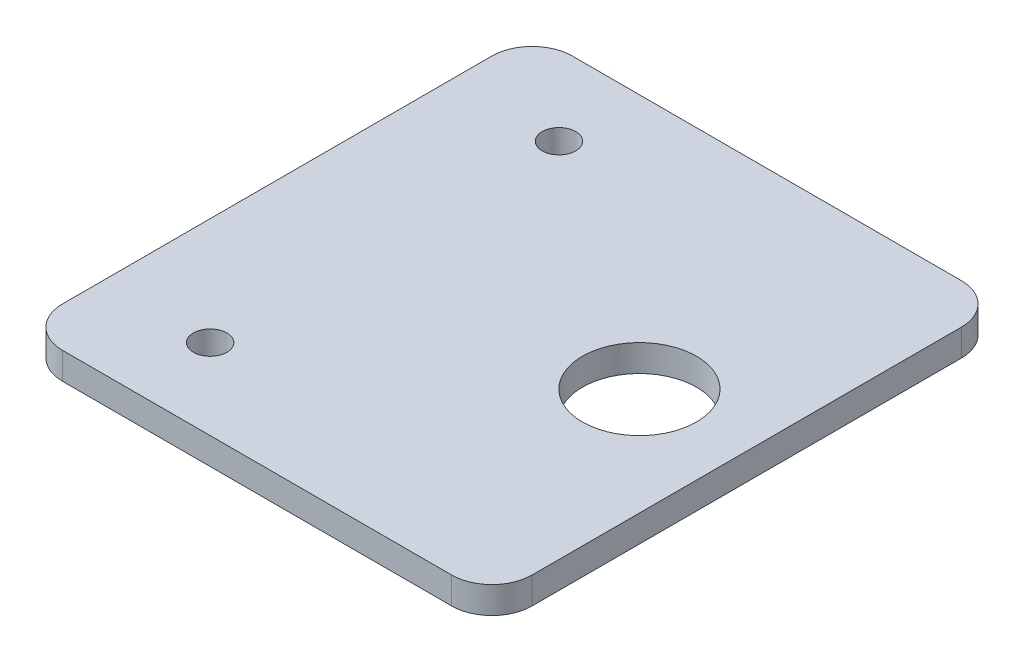
ISO-10303-21;
HEADER;
FILE_DESCRIPTION(('STEP AP214'),'2;1');
FILE_NAME('part.step','',(''),(''),'','','');
FILE_SCHEMA(('AUTOMOTIVE_DESIGN { 1 0 10303 214 1 1 1 1 }'));
ENDSEC;
DATA;
#1=APPLICATION_CONTEXT('core data for automotive mechanical design processes');
#2=APPLICATION_PROTOCOL_DEFINITION('international standard','automotive_design',2000,#1);
#3=PRODUCT_CONTEXT('',#1,'mechanical');
#4=PRODUCT('Part','Part','',(#3));
#5=PRODUCT_RELATED_PRODUCT_CATEGORY('part','',(#4));
#6=PRODUCT_DEFINITION_FORMATION('','',#4);
#7=PRODUCT_DEFINITION_CONTEXT('part definition',#1,'design');
#8=PRODUCT_DEFINITION('design','',#6,#7);
#9=PRODUCT_DEFINITION_SHAPE('','',#8);
#10=(LENGTH_UNIT() NAMED_UNIT(*) SI_UNIT(.MILLI.,.METRE.));
#11=(NAMED_UNIT(*) PLANE_ANGLE_UNIT() SI_UNIT($,.RADIAN.));
#12=(NAMED_UNIT(*) SI_UNIT($,.STERADIAN.) SOLID_ANGLE_UNIT());
#13=UNCERTAINTY_MEASURE_WITH_UNIT(LENGTH_MEASURE(1.E-05),#10,'distance_accuracy_value','');
#14=(GEOMETRIC_REPRESENTATION_CONTEXT(3) GLOBAL_UNCERTAINTY_ASSIGNED_CONTEXT((#13)) GLOBAL_UNIT_ASSIGNED_CONTEXT((#10,
#11,#12)) REPRESENTATION_CONTEXT('',''));
#15=CARTESIAN_POINT('',(0.,0.,0.));
#16=DIRECTION('',(0.,0.,1.));
#17=DIRECTION('',(1.,0.,0.));
#18=AXIS2_PLACEMENT_3D('',#15,#16,#17);
#19=CARTESIAN_POINT('',(-17.5,-2.,19.));
#20=DIRECTION('',(-1.,0.,0.));
#21=DIRECTION('',(0.,0.,1.));
#22=AXIS2_PLACEMENT_3D('',#19,#20,#21);
#23=PLANE('',#22);
#24=DIRECTION('',(0.,0.,1.));
#25=VECTOR('',#24,1.);
#26=CARTESIAN_POINT('',(-17.5,0.,19.));
#27=LINE('',#26,#25);
#28=CARTESIAN_POINT('',(-17.5,0.,-16.));
#29=VERTEX_POINT('',#28);
#30=CARTESIAN_POINT('',(-17.5,0.,16.));
#31=VERTEX_POINT('',#30);
#32=EDGE_CURVE('E168',#29,#31,#27,.T.);
#33=ORIENTED_EDGE('',*,*,#32,.F.);
#34=DIRECTION('',(0.,1.,0.));
#35=VECTOR('',#34,1.);
#36=CARTESIAN_POINT('',(-17.5,-2.,-16.));
#37=LINE('',#36,#35);
#38=CARTESIAN_POINT('',(-17.5,-2.,-16.));
#39=VERTEX_POINT('',#38);
#40=EDGE_CURVE('E157',#29,#39,#37,.F.);
#41=ORIENTED_EDGE('',*,*,#40,.T.);
#42=DIRECTION('',(0.,0.,1.));
#43=VECTOR('',#42,1.);
#44=CARTESIAN_POINT('',(-17.5,-2.,19.));
#45=LINE('',#44,#43);
#46=CARTESIAN_POINT('',(-17.5,-2.,16.));
#47=VERTEX_POINT('',#46);
#48=EDGE_CURVE('E161',#39,#47,#45,.T.);
#49=ORIENTED_EDGE('',*,*,#48,.T.);
#50=DIRECTION('',(0.,1.,0.));
#51=VECTOR('',#50,1.);
#52=CARTESIAN_POINT('',(-17.5,-2.,16.));
#53=LINE('',#52,#51);
#54=EDGE_CURVE('E154',#47,#31,#53,.T.);
#55=ORIENTED_EDGE('',*,*,#54,.T.);
#56=EDGE_LOOP('',(#33,#41,#49,#55));
#57=FACE_BOUND('',#56,.T.);
#58=ADVANCED_FACE('F44',(#57),#23,.T.);
#59=CARTESIAN_POINT('',(17.5,-2.,-19.));
#60=DIRECTION('',(0.,0.,-1.));
#61=DIRECTION('',(-1.,0.,0.));
#62=AXIS2_PLACEMENT_3D('',#59,#60,#61);
#63=PLANE('',#62);
#64=DIRECTION('',(-1.,0.,0.));
#65=VECTOR('',#64,1.);
#66=CARTESIAN_POINT('',(17.5,0.,-19.));
#67=LINE('',#66,#65);
#68=CARTESIAN_POINT('',(14.5,0.,-19.));
#69=VERTEX_POINT('',#68);
#70=CARTESIAN_POINT('',(-14.5,0.,-19.));
#71=VERTEX_POINT('',#70);
#72=EDGE_CURVE('E127',#69,#71,#67,.T.);
#73=ORIENTED_EDGE('',*,*,#72,.F.);
#74=DIRECTION('',(0.,1.,0.));
#75=VECTOR('',#74,1.);
#76=CARTESIAN_POINT('',(14.5,-2.,-19.));
#77=LINE('',#76,#75);
#78=CARTESIAN_POINT('',(14.5,-2.,-19.));
#79=VERTEX_POINT('',#78);
#80=EDGE_CURVE('E145',#69,#79,#77,.F.);
#81=ORIENTED_EDGE('',*,*,#80,.T.);
#82=DIRECTION('',(-1.,0.,0.));
#83=VECTOR('',#82,1.);
#84=CARTESIAN_POINT('',(17.5,-2.,-19.));
#85=LINE('',#84,#83);
#86=CARTESIAN_POINT('',(-14.5,-2.,-19.));
#87=VERTEX_POINT('',#86);
#88=EDGE_CURVE('E129',#79,#87,#85,.T.);
#89=ORIENTED_EDGE('',*,*,#88,.T.);
#90=DIRECTION('',(0.,1.,0.));
#91=VECTOR('',#90,1.);
#92=CARTESIAN_POINT('',(-14.5,-2.,-19.));
#93=LINE('',#92,#91);
#94=EDGE_CURVE('E142',#87,#71,#93,.T.);
#95=ORIENTED_EDGE('',*,*,#94,.T.);
#96=EDGE_LOOP('',(#73,#81,#89,#95));
#97=FACE_BOUND('',#96,.T.);
#98=ADVANCED_FACE('F217',(#97),#63,.T.);
#99=CARTESIAN_POINT('',(17.5,-2.,19.));
#100=DIRECTION('',(1.,0.,0.));
#101=DIRECTION('',(0.,0.,-1.));
#102=AXIS2_PLACEMENT_3D('',#99,#100,#101);
#103=PLANE('',#102);
#104=DIRECTION('',(0.,0.,-1.));
#105=VECTOR('',#104,1.);
#106=CARTESIAN_POINT('',(17.5,-2.,19.));
#107=LINE('',#106,#105);
#108=CARTESIAN_POINT('',(17.5,-2.,16.));
#109=VERTEX_POINT('',#108);
#110=CARTESIAN_POINT('',(17.5,-2.,-16.));
#111=VERTEX_POINT('',#110);
#112=EDGE_CURVE('E133',#109,#111,#107,.T.);
#113=ORIENTED_EDGE('',*,*,#112,.T.);
#114=DIRECTION('',(0.,1.,0.));
#115=VECTOR('',#114,1.);
#116=CARTESIAN_POINT('',(17.5,-2.,-16.));
#117=LINE('',#116,#115);
#118=CARTESIAN_POINT('',(17.5,0.,-16.));
#119=VERTEX_POINT('',#118);
#120=EDGE_CURVE('E119',#111,#119,#117,.T.);
#121=ORIENTED_EDGE('',*,*,#120,.T.);
#122=DIRECTION('',(0.,0.,-1.));
#123=VECTOR('',#122,1.);
#124=CARTESIAN_POINT('',(17.5,0.,19.));
#125=LINE('',#124,#123);
#126=CARTESIAN_POINT('',(17.5,0.,16.));
#127=VERTEX_POINT('',#126);
#128=EDGE_CURVE('E112',#127,#119,#125,.T.);
#129=ORIENTED_EDGE('',*,*,#128,.F.);
#130=DIRECTION('',(0.,1.,0.));
#131=VECTOR('',#130,1.);
#132=CARTESIAN_POINT('',(17.5,-2.,16.));
#133=LINE('',#132,#131);
#134=EDGE_CURVE('E125',#127,#109,#133,.F.);
#135=ORIENTED_EDGE('',*,*,#134,.T.);
#136=EDGE_LOOP('',(#113,#121,#129,#135));
#137=FACE_BOUND('',#136,.T.);
#138=ADVANCED_FACE('F124',(#137),#103,.T.);
#139=CARTESIAN_POINT('',(17.5,-2.,19.));
#140=DIRECTION('',(0.,0.,1.));
#141=DIRECTION('',(1.,0.,0.));
#142=AXIS2_PLACEMENT_3D('',#139,#140,#141);
#143=PLANE('',#142);
#144=DIRECTION('',(1.,0.,0.));
#145=VECTOR('',#144,1.);
#146=CARTESIAN_POINT('',(17.5,0.,19.));
#147=LINE('',#146,#145);
#148=CARTESIAN_POINT('',(-14.5,0.,19.));
#149=VERTEX_POINT('',#148);
#150=CARTESIAN_POINT('',(14.5,0.,19.));
#151=VERTEX_POINT('',#150);
#152=EDGE_CURVE('E113',#149,#151,#147,.T.);
#153=ORIENTED_EDGE('',*,*,#152,.F.);
#154=DIRECTION('',(0.,1.,0.));
#155=VECTOR('',#154,1.);
#156=CARTESIAN_POINT('',(-14.5,-2.,19.));
#157=LINE('',#156,#155);
#158=CARTESIAN_POINT('',(-14.5,-2.,19.));
#159=VERTEX_POINT('',#158);
#160=EDGE_CURVE('E11',#149,#159,#157,.F.);
#161=ORIENTED_EDGE('',*,*,#160,.T.);
#162=DIRECTION('',(1.,0.,0.));
#163=VECTOR('',#162,1.);
#164=CARTESIAN_POINT('',(17.5,-2.,19.));
#165=LINE('',#164,#163);
#166=CARTESIAN_POINT('',(14.5,-2.,19.));
#167=VERTEX_POINT('',#166);
#168=EDGE_CURVE('E159',#159,#167,#165,.T.);
#169=ORIENTED_EDGE('',*,*,#168,.T.);
#170=DIRECTION('',(0.,1.,0.));
#171=VECTOR('',#170,1.);
#172=CARTESIAN_POINT('',(14.5,-2.,19.));
#173=LINE('',#172,#171);
#174=EDGE_CURVE('E52',#167,#151,#173,.T.);
#175=ORIENTED_EDGE('',*,*,#174,.T.);
#176=EDGE_LOOP('',(#153,#161,#169,#175));
#177=FACE_BOUND('',#176,.T.);
#178=ADVANCED_FACE('F158',(#177),#143,.T.);
#179=CARTESIAN_POINT('',(0.,-2.,0.));
#180=DIRECTION('',(0.,1.,0.));
#181=DIRECTION('',(0.,0.,1.));
#182=AXIS2_PLACEMENT_3D('',#179,#180,#181);
#183=PLANE('',#182);
#184=CARTESIAN_POINT('',(9.5,-2.,0.));
#185=DIRECTION('',(0.,1.,0.));
#186=DIRECTION('',(0.,0.,1.));
#187=AXIS2_PLACEMENT_3D('',#184,#185,#186);
#188=CIRCLE('',#187,4.24999999999999);
#189=CARTESIAN_POINT('',(9.5,-2.,4.24999999999999));
#190=VERTEX_POINT('',#189);
#191=EDGE_CURVE('E186',#190,#190,#188,.T.);
#192=ORIENTED_EDGE('',*,*,#191,.T.);
#193=EDGE_LOOP('',(#192));
#194=FACE_BOUND('',#193,.T.);
#195=CARTESIAN_POINT('',(-9.5,-2.,13.));
#196=DIRECTION('',(0.,1.,0.));
#197=DIRECTION('',(0.,0.,1.));
#198=AXIS2_PLACEMENT_3D('',#195,#196,#197);
#199=CIRCLE('',#198,1.25);
#200=CARTESIAN_POINT('',(-9.5,-2.,14.25));
#201=VERTEX_POINT('',#200);
#202=EDGE_CURVE('E178',#201,#201,#199,.T.);
#203=ORIENTED_EDGE('',*,*,#202,.T.);
#204=EDGE_LOOP('',(#203));
#205=FACE_BOUND('',#204,.T.);
#206=CARTESIAN_POINT('',(-9.5,-2.,-13.));
#207=DIRECTION('',(0.,1.,0.));
#208=DIRECTION('',(0.,0.,1.));
#209=AXIS2_PLACEMENT_3D('',#206,#207,#208);
#210=CIRCLE('',#209,1.25);
#211=CARTESIAN_POINT('',(-9.5,-2.,-11.75));
#212=VERTEX_POINT('',#211);
#213=EDGE_CURVE('E171',#212,#212,#210,.T.);
#214=ORIENTED_EDGE('',*,*,#213,.T.);
#215=EDGE_LOOP('',(#214));
#216=FACE_BOUND('',#215,.T.);
#217=ORIENTED_EDGE('',*,*,#88,.F.);
#218=CARTESIAN_POINT('',(14.5,-2.,-16.));
#219=DIRECTION('',(0.,1.,0.));
#220=DIRECTION('',(0.,0.,1.));
#221=AXIS2_PLACEMENT_3D('',#218,#219,#220);
#222=CIRCLE('',#221,3.);
#223=EDGE_CURVE('E152',#79,#111,#222,.F.);
#224=ORIENTED_EDGE('',*,*,#223,.T.);
#225=ORIENTED_EDGE('',*,*,#112,.F.);
#226=CARTESIAN_POINT('',(14.5,-2.,16.));
#227=DIRECTION('',(0.,1.,0.));
#228=DIRECTION('',(0.,0.,1.));
#229=AXIS2_PLACEMENT_3D('',#226,#227,#228);
#230=CIRCLE('',#229,3.);
#231=EDGE_CURVE('E59',#109,#167,#230,.F.);
#232=ORIENTED_EDGE('',*,*,#231,.T.);
#233=ORIENTED_EDGE('',*,*,#168,.F.);
#234=CARTESIAN_POINT('',(-14.5,-2.,16.));
#235=DIRECTION('',(0.,1.,0.));
#236=DIRECTION('',(0.,0.,1.));
#237=AXIS2_PLACEMENT_3D('',#234,#235,#236);
#238=CIRCLE('',#237,3.);
#239=EDGE_CURVE('E148',#159,#47,#238,.F.);
#240=ORIENTED_EDGE('',*,*,#239,.T.);
#241=ORIENTED_EDGE('',*,*,#48,.F.);
#242=CARTESIAN_POINT('',(-14.5,-2.,-16.));
#243=DIRECTION('',(0.,1.,0.));
#244=DIRECTION('',(0.,0.,1.));
#245=AXIS2_PLACEMENT_3D('',#242,#243,#244);
#246=CIRCLE('',#245,3.);
#247=EDGE_CURVE('E150',#39,#87,#246,.F.);
#248=ORIENTED_EDGE('',*,*,#247,.T.);
#249=EDGE_LOOP('',(#217,#224,#225,#232,#233,#240,#241,#248));
#250=FACE_BOUND('',#249,.T.);
#251=ADVANCED_FACE('F199',(#194,#205,#216,#250),#183,.F.);
#252=CARTESIAN_POINT('',(0.,0.,0.));
#253=DIRECTION('',(0.,1.,0.));
#254=DIRECTION('',(0.,0.,1.));
#255=AXIS2_PLACEMENT_3D('',#252,#253,#254);
#256=PLANE('',#255);
#257=CARTESIAN_POINT('',(9.5,0.,0.));
#258=DIRECTION('',(0.,1.,0.));
#259=DIRECTION('',(0.,0.,1.));
#260=AXIS2_PLACEMENT_3D('',#257,#258,#259);
#261=CIRCLE('',#260,4.24999999999999);
#262=CARTESIAN_POINT('',(9.5,0.,4.24999999999999));
#263=VERTEX_POINT('',#262);
#264=EDGE_CURVE('E189',#263,#263,#261,.T.);
#265=ORIENTED_EDGE('',*,*,#264,.F.);
#266=EDGE_LOOP('',(#265));
#267=FACE_BOUND('',#266,.T.);
#268=CARTESIAN_POINT('',(-9.5,0.,13.));
#269=DIRECTION('',(0.,1.,0.));
#270=DIRECTION('',(0.,0.,1.));
#271=AXIS2_PLACEMENT_3D('',#268,#269,#270);
#272=CIRCLE('',#271,1.24999999999999);
#273=CARTESIAN_POINT('',(-9.5,0.,14.25));
#274=VERTEX_POINT('',#273);
#275=EDGE_CURVE('E183',#274,#274,#272,.T.);
#276=ORIENTED_EDGE('',*,*,#275,.F.);
#277=EDGE_LOOP('',(#276));
#278=FACE_BOUND('',#277,.T.);
#279=CARTESIAN_POINT('',(-9.5,0.,-13.));
#280=DIRECTION('',(0.,1.,0.));
#281=DIRECTION('',(0.,0.,1.));
#282=AXIS2_PLACEMENT_3D('',#279,#280,#281);
#283=CIRCLE('',#282,1.24999999999999);
#284=CARTESIAN_POINT('',(-9.5,0.,-11.75));
#285=VERTEX_POINT('',#284);
#286=EDGE_CURVE('E174',#285,#285,#283,.T.);
#287=ORIENTED_EDGE('',*,*,#286,.F.);
#288=EDGE_LOOP('',(#287));
#289=FACE_BOUND('',#288,.T.);
#290=ORIENTED_EDGE('',*,*,#128,.T.);
#291=CARTESIAN_POINT('',(14.5,0.,-16.));
#292=DIRECTION('',(0.,1.,0.));
#293=DIRECTION('',(0.,0.,1.));
#294=AXIS2_PLACEMENT_3D('',#291,#292,#293);
#295=CIRCLE('',#294,3.);
#296=EDGE_CURVE('E140',#119,#69,#295,.T.);
#297=ORIENTED_EDGE('',*,*,#296,.T.);
#298=ORIENTED_EDGE('',*,*,#72,.T.);
#299=CARTESIAN_POINT('',(-14.5,0.,-16.));
#300=DIRECTION('',(0.,1.,0.));
#301=DIRECTION('',(0.,0.,1.));
#302=AXIS2_PLACEMENT_3D('',#299,#300,#301);
#303=CIRCLE('',#302,3.);
#304=EDGE_CURVE('E138',#71,#29,#303,.T.);
#305=ORIENTED_EDGE('',*,*,#304,.T.);
#306=ORIENTED_EDGE('',*,*,#32,.T.);
#307=CARTESIAN_POINT('',(-14.5,0.,16.));
#308=DIRECTION('',(0.,1.,0.));
#309=DIRECTION('',(0.,0.,1.));
#310=AXIS2_PLACEMENT_3D('',#307,#308,#309);
#311=CIRCLE('',#310,3.);
#312=EDGE_CURVE('E118',#31,#149,#311,.T.);
#313=ORIENTED_EDGE('',*,*,#312,.T.);
#314=ORIENTED_EDGE('',*,*,#152,.T.);
#315=CARTESIAN_POINT('',(14.5,0.,16.));
#316=DIRECTION('',(0.,1.,0.));
#317=DIRECTION('',(0.,0.,1.));
#318=AXIS2_PLACEMENT_3D('',#315,#316,#317);
#319=CIRCLE('',#318,3.);
#320=EDGE_CURVE('E109',#151,#127,#319,.T.);
#321=ORIENTED_EDGE('',*,*,#320,.T.);
#322=EDGE_LOOP('',(#290,#297,#298,#305,#306,#313,#314,#321));
#323=FACE_BOUND('',#322,.T.);
#324=ADVANCED_FACE('F111',(#267,#278,#289,#323),#256,.T.);
#325=CARTESIAN_POINT('',(-9.5,0.,-13.));
#326=DIRECTION('',(0.,1.,0.));
#327=DIRECTION('',(0.,0.,1.));
#328=AXIS2_PLACEMENT_3D('',#325,#326,#327);
#329=CYLINDRICAL_SURFACE('',#328,1.24999999999999);
#330=ORIENTED_EDGE('',*,*,#213,.F.);
#331=EDGE_LOOP('',(#330));
#332=FACE_BOUND('',#331,.T.);
#333=ORIENTED_EDGE('',*,*,#286,.T.);
#334=EDGE_LOOP('',(#333));
#335=FACE_BOUND('',#334,.T.);
#336=ADVANCED_FACE('F198',(#332,#335),#329,.F.);
#337=CARTESIAN_POINT('',(-9.5,0.,13.));
#338=DIRECTION('',(0.,1.,0.));
#339=DIRECTION('',(0.,0.,1.));
#340=AXIS2_PLACEMENT_3D('',#337,#338,#339);
#341=CYLINDRICAL_SURFACE('',#340,1.24999999999999);
#342=ORIENTED_EDGE('',*,*,#202,.F.);
#343=EDGE_LOOP('',(#342));
#344=FACE_BOUND('',#343,.T.);
#345=ORIENTED_EDGE('',*,*,#275,.T.);
#346=EDGE_LOOP('',(#345));
#347=FACE_BOUND('',#346,.T.);
#348=ADVANCED_FACE('F206',(#344,#347),#341,.F.);
#349=CARTESIAN_POINT('',(14.5,-2.,-16.));
#350=DIRECTION('',(0.,1.,0.));
#351=DIRECTION('',(0.,0.,1.));
#352=AXIS2_PLACEMENT_3D('',#349,#350,#351);
#353=CYLINDRICAL_SURFACE('',#352,3.);
#354=ORIENTED_EDGE('',*,*,#223,.F.);
#355=ORIENTED_EDGE('',*,*,#80,.F.);
#356=ORIENTED_EDGE('',*,*,#296,.F.);
#357=ORIENTED_EDGE('',*,*,#120,.F.);
#358=EDGE_LOOP('',(#354,#355,#356,#357));
#359=FACE_BOUND('',#358,.T.);
#360=ADVANCED_FACE('F212',(#359),#353,.T.);
#361=CARTESIAN_POINT('',(-14.5,-2.,-16.));
#362=DIRECTION('',(0.,1.,0.));
#363=DIRECTION('',(0.,0.,1.));
#364=AXIS2_PLACEMENT_3D('',#361,#362,#363);
#365=CYLINDRICAL_SURFACE('',#364,3.);
#366=ORIENTED_EDGE('',*,*,#247,.F.);
#367=ORIENTED_EDGE('',*,*,#40,.F.);
#368=ORIENTED_EDGE('',*,*,#304,.F.);
#369=ORIENTED_EDGE('',*,*,#94,.F.);
#370=EDGE_LOOP('',(#366,#367,#368,#369));
#371=FACE_BOUND('',#370,.T.);
#372=ADVANCED_FACE('F230',(#371),#365,.T.);
#373=CARTESIAN_POINT('',(-14.5,-2.,16.));
#374=DIRECTION('',(0.,1.,0.));
#375=DIRECTION('',(0.,0.,1.));
#376=AXIS2_PLACEMENT_3D('',#373,#374,#375);
#377=CYLINDRICAL_SURFACE('',#376,3.);
#378=ORIENTED_EDGE('',*,*,#239,.F.);
#379=ORIENTED_EDGE('',*,*,#160,.F.);
#380=ORIENTED_EDGE('',*,*,#312,.F.);
#381=ORIENTED_EDGE('',*,*,#54,.F.);
#382=EDGE_LOOP('',(#378,#379,#380,#381));
#383=FACE_BOUND('',#382,.T.);
#384=ADVANCED_FACE('F233',(#383),#377,.T.);
#385=CARTESIAN_POINT('',(14.5,-2.,16.));
#386=DIRECTION('',(0.,1.,0.));
#387=DIRECTION('',(0.,0.,1.));
#388=AXIS2_PLACEMENT_3D('',#385,#386,#387);
#389=CYLINDRICAL_SURFACE('',#388,3.);
#390=ORIENTED_EDGE('',*,*,#231,.F.);
#391=ORIENTED_EDGE('',*,*,#134,.F.);
#392=ORIENTED_EDGE('',*,*,#320,.F.);
#393=ORIENTED_EDGE('',*,*,#174,.F.);
#394=EDGE_LOOP('',(#390,#391,#392,#393));
#395=FACE_BOUND('',#394,.T.);
#396=ADVANCED_FACE('F46',(#395),#389,.T.);
#397=CARTESIAN_POINT('',(9.5,0.,0.));
#398=DIRECTION('',(0.,1.,0.));
#399=DIRECTION('',(0.,0.,1.));
#400=AXIS2_PLACEMENT_3D('',#397,#398,#399);
#401=CYLINDRICAL_SURFACE('',#400,4.24999999999999);
#402=ORIENTED_EDGE('',*,*,#264,.T.);
#403=EDGE_LOOP('',(#402));
#404=FACE_BOUND('',#403,.T.);
#405=ORIENTED_EDGE('',*,*,#191,.F.);
#406=EDGE_LOOP('',(#405));
#407=FACE_BOUND('',#406,.T.);
#408=ADVANCED_FACE('F193',(#404,#407),#401,.F.);
#409=CLOSED_SHELL('',(#58,#98,#138,#178,#251,#324,#336,#348,#360,#372,#384,#396,#408));
#410=MANIFOLD_SOLID_BREP('B2',#409);
#411=ADVANCED_BREP_SHAPE_REPRESENTATION('',(#18,#410),#14);
#412=SHAPE_DEFINITION_REPRESENTATION(#9,#411);
ENDSEC;
END-ISO-10303-21;
